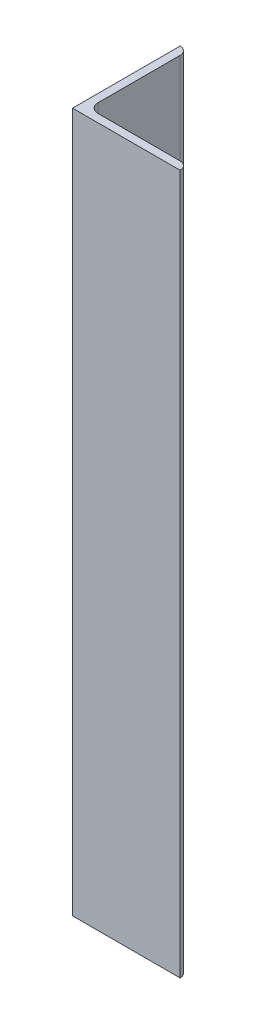
ISO-10303-21;
HEADER;
FILE_DESCRIPTION(('STEP AP214'),'2;1');
FILE_NAME('part.step','',(''),(''),'','','');
FILE_SCHEMA(('AUTOMOTIVE_DESIGN { 1 0 10303 214 1 1 1 1 }'));
ENDSEC;
DATA;
#1=APPLICATION_CONTEXT('core data for automotive mechanical design processes');
#2=APPLICATION_PROTOCOL_DEFINITION('international standard','automotive_design',2000,#1);
#3=PRODUCT_CONTEXT('',#1,'mechanical');
#4=PRODUCT('Part','Part','',(#3));
#5=PRODUCT_RELATED_PRODUCT_CATEGORY('part','',(#4));
#6=PRODUCT_DEFINITION_FORMATION('','',#4);
#7=PRODUCT_DEFINITION_CONTEXT('part definition',#1,'design');
#8=PRODUCT_DEFINITION('design','',#6,#7);
#9=PRODUCT_DEFINITION_SHAPE('','',#8);
#10=(LENGTH_UNIT() NAMED_UNIT(*) SI_UNIT(.MILLI.,.METRE.));
#11=(NAMED_UNIT(*) PLANE_ANGLE_UNIT() SI_UNIT($,.RADIAN.));
#12=(NAMED_UNIT(*) SI_UNIT($,.STERADIAN.) SOLID_ANGLE_UNIT());
#13=UNCERTAINTY_MEASURE_WITH_UNIT(LENGTH_MEASURE(1.E-05),#10,'distance_accuracy_value','');
#14=(GEOMETRIC_REPRESENTATION_CONTEXT(3) GLOBAL_UNCERTAINTY_ASSIGNED_CONTEXT((#13)) GLOBAL_UNIT_ASSIGNED_CONTEXT((#10,
#11,#12)) REPRESENTATION_CONTEXT('',''));
#15=CARTESIAN_POINT('',(0.,0.,0.));
#16=DIRECTION('',(0.,0.,1.));
#17=DIRECTION('',(1.,0.,0.));
#18=AXIS2_PLACEMENT_3D('',#15,#16,#17);
#19=CARTESIAN_POINT('',(6.5,260.,-6.5));
#20=DIRECTION('',(0.,-1.,0.));
#21=DIRECTION('',(0.,0.,-1.));
#22=AXIS2_PLACEMENT_3D('',#19,#20,#21);
#23=CYLINDRICAL_SURFACE('',#22,3.5);
#24=CARTESIAN_POINT('',(3.,53.,-6.5));
#25=CARTESIAN_POINT('',(3.00003465615781,52.880587045641,-6.41041578691727));
#26=CARTESIAN_POINT('',(3.00343908972094,52.7572091536423,-6.32626209532385));
#27=CARTESIAN_POINT('',(3.01475149706634,52.5036429804455,-6.16941930243955));
#28=CARTESIAN_POINT('',(3.02265705055746,52.3734583934039,-6.09672406663878));
#29=CARTESIAN_POINT('',(3.0407457169967,52.1071912285186,-5.96326592235403));
#30=CARTESIAN_POINT('',(3.05093013692755,51.9711053023729,-5.90250989899215));
#31=CARTESIAN_POINT('',(3.0716218282051,51.6940682025578,-5.79337793603691));
#32=CARTESIAN_POINT('',(3.08212911471688,51.553116800318,-5.74500257896358));
#33=CARTESIAN_POINT('',(3.10103079349939,51.2781965850149,-5.6641793572028));
#34=CARTESIAN_POINT('',(3.10952492033591,51.1445069207829,-5.630802989711));
#35=CARTESIAN_POINT('',(3.12427183226853,50.8747130810141,-5.57518095020948));
#36=CARTESIAN_POINT('',(3.13052480368225,50.7386091071777,-5.5529343528696));
#37=CARTESIAN_POINT('',(3.14001955973739,50.4651416451601,-5.5197808130512));
#38=CARTESIAN_POINT('',(3.14326616892785,50.3277805334759,-5.5088556987189));
#39=CARTESIAN_POINT('',(3.14637663539547,50.0525849594647,-5.49838081504847));
#40=CARTESIAN_POINT('',(3.14624049666752,49.914750497697,-5.49883103227655));
#41=CARTESIAN_POINT('',(3.14261445658247,49.6405795785242,-5.51106038294783));
#42=CARTESIAN_POINT('',(3.13914755507232,49.5042393296797,-5.52276182400619));
#43=CARTESIAN_POINT('',(3.12930369663528,49.2330780071279,-5.55727686094002));
#44=CARTESIAN_POINT('',(3.12292663400514,49.0982569887846,-5.58009086044926));
#45=CARTESIAN_POINT('',(3.10802002821223,48.830905330998,-5.63667698800648));
#46=CARTESIAN_POINT('',(3.09948809255575,48.698377413432,-5.67046130807605));
#47=CARTESIAN_POINT('',(3.08134196208269,48.4366066864843,-5.74874102719263));
#48=CARTESIAN_POINT('',(3.07172784053944,48.3073636554127,-5.79323570128818));
#49=CARTESIAN_POINT('',(3.05437572725588,48.0750153719139,-5.88402982037458));
#50=CARTESIAN_POINT('',(3.04660149471746,47.9712639401068,-5.92867838985153));
#51=CARTESIAN_POINT('',(3.03205221100526,47.7669830356644,-6.02491562979986));
#52=CARTESIAN_POINT('',(3.02527691835641,47.6664527889817,-6.07650261725356));
#53=CARTESIAN_POINT('',(3.01364734312072,47.4692073996564,-6.18632402594371));
#54=CARTESIAN_POINT('',(3.00878957985084,47.3724856339951,-6.24454615314865));
#55=CARTESIAN_POINT('',(3.00197050062827,47.1830805422588,-6.36747790715241));
#56=CARTESIAN_POINT('',(3.00001076254811,47.0903994428144,-6.43219104762039));
#57=CARTESIAN_POINT('',(3.,47.,-6.50000000000001));
#58=B_SPLINE_CURVE_WITH_KNOTS('',3,(#24,#25,#26,#27,#28,#29,#30,#31,#32,#33,#34,#35,#36,#37,#38,
#39,#40,#41,#42,#43,#44,#45,#46,#47,#48,#49,#50,#51,#52,#53,#54,#55,#56,#57),.UNSPECIFIED.,.F.,
.F.,(4,2,2,2,2,2,2,2,2,2,2,2,2,2,2,2,4),(0.,0.447535207829765,0.894829999062702,
1.34238198476457,1.78995502426764,2.20364646574524,2.61730350715769,3.03029556385332,
3.44328713282238,3.85344722529425,4.26362221683792,4.6742546313859,5.08485925928004,
5.42426309223212,5.76358474565473,6.10228760129509,6.4411748008872),.UNSPECIFIED.);
#59=CARTESIAN_POINT('',(3.,53.,-6.5));
#60=VERTEX_POINT('',#59);
#61=CARTESIAN_POINT('',(3.,47.,-6.5));
#62=VERTEX_POINT('',#61);
#63=EDGE_CURVE('E321',#60,#62,#58,.T.);
#64=ORIENTED_EDGE('',*,*,#63,.F.);
#65=DIRECTION('',(0.,-1.,0.));
#66=VECTOR('',#65,1.);
#67=CARTESIAN_POINT('',(3.,260.,-6.5));
#68=LINE('',#67,#66);
#69=CARTESIAN_POINT('',(3.,76.9999999999999,-6.5));
#70=VERTEX_POINT('',#69);
#71=EDGE_CURVE('E317',#70,#60,#68,.T.);
#72=ORIENTED_EDGE('',*,*,#71,.F.);
#73=CARTESIAN_POINT('',(3.,83.0000000000001,-6.5));
#74=CARTESIAN_POINT('',(3.00003465615781,82.8805870456411,-6.41041578691727));
#75=CARTESIAN_POINT('',(3.00343908972094,82.7572091536424,-6.32626209532385));
#76=CARTESIAN_POINT('',(3.01475149706634,82.5036429804457,-6.16941930243954));
#77=CARTESIAN_POINT('',(3.02265705055746,82.3734583934041,-6.09672406663877));
#78=CARTESIAN_POINT('',(3.0407457169967,82.1071912285188,-5.963265922354));
#79=CARTESIAN_POINT('',(3.05093013692756,81.971105302373,-5.90250989899212));
#80=CARTESIAN_POINT('',(3.07162182820511,81.694068202558,-5.79337793603687));
#81=CARTESIAN_POINT('',(3.08212911471689,81.5531168003182,-5.74500257896354));
#82=CARTESIAN_POINT('',(3.1010307934994,81.2781965850151,-5.66417935720275));
#83=CARTESIAN_POINT('',(3.10952492033592,81.1445069207831,-5.63080298971094));
#84=CARTESIAN_POINT('',(3.12427183226855,80.8747130810142,-5.57518095020942));
#85=CARTESIAN_POINT('',(3.13052480368227,80.7386091071779,-5.55293435286953));
#86=CARTESIAN_POINT('',(3.14001955973742,80.4651416451603,-5.51978081305113));
#87=CARTESIAN_POINT('',(3.14326616892788,80.3277805334761,-5.50885569871882));
#88=CARTESIAN_POINT('',(3.1463766353955,80.0525849594649,-5.49838081504838));
#89=CARTESIAN_POINT('',(3.14624049666755,79.9147504976972,-5.49883103227645));
#90=CARTESIAN_POINT('',(3.14261445658251,79.6405795785244,-5.51106038294772));
#91=CARTESIAN_POINT('',(3.13914755507236,79.5042393296799,-5.52276182400607));
#92=CARTESIAN_POINT('',(3.12930369663531,79.2330780071281,-5.5572768609399));
#93=CARTESIAN_POINT('',(3.12292663400518,79.0982569887848,-5.58009086044913));
#94=CARTESIAN_POINT('',(3.10802002821227,78.8309053309982,-5.63667698800634));
#95=CARTESIAN_POINT('',(3.09948809255579,78.6983774134322,-5.6704613080759));
#96=CARTESIAN_POINT('',(3.08134196208273,78.4366066864845,-5.74874102719247));
#97=CARTESIAN_POINT('',(3.07172784053948,78.3073636554129,-5.79323570128802));
#98=CARTESIAN_POINT('',(3.05437572725591,78.0750153719141,-5.88402982037442));
#99=CARTESIAN_POINT('',(3.04660149471749,77.9712639401069,-5.92867838985137));
#100=CARTESIAN_POINT('',(3.03205221100528,77.7669830356645,-6.02491562979973));
#101=CARTESIAN_POINT('',(3.02527691835642,77.6664527889818,-6.07650261725344));
#102=CARTESIAN_POINT('',(3.01364734312073,77.4692073996564,-6.18632402594362));
#103=CARTESIAN_POINT('',(3.00878957985085,77.3724856339951,-6.24454615314858));
#104=CARTESIAN_POINT('',(3.00197050062827,77.1830805422587,-6.36747790715237));
#105=CARTESIAN_POINT('',(3.00001076254811,77.0903994428144,-6.43219104762036));
#106=CARTESIAN_POINT('',(3.,76.9999999999999,-6.5));
#107=B_SPLINE_CURVE_WITH_KNOTS('',3,(#73,#74,#75,#76,#77,#78,#79,#80,#81,#82,#83,#84,#85,#86,
#87,#88,#89,#90,#91,#92,#93,#94,#95,#96,#97,#98,#99,#100,#101,#102,#103,#104,#105,#106),
.UNSPECIFIED.,.F.,.F.,(4,2,2,2,2,2,2,2,2,2,2,2,2,2,2,2,4),(0.,0.447535207829761,
0.894829999062705,1.34238198476459,1.78995502426765,2.20364646574525,2.61730350715769,
3.03029556385332,3.44328713282236,3.85344722529422,4.26362221683789,4.67425463138587,
5.08485925928002,5.42426309223217,5.76358474565488,6.10228760129531,6.44117480088752),.UNSPECIFIED.);
#108=CARTESIAN_POINT('',(3.,83.0000000000001,-6.5));
#109=VERTEX_POINT('',#108);
#110=EDGE_CURVE('E265',#109,#70,#107,.T.);
#111=ORIENTED_EDGE('',*,*,#110,.F.);
#112=CARTESIAN_POINT('',(3.,260.,-6.5));
#113=VERTEX_POINT('',#112);
#114=EDGE_CURVE('E345',#113,#109,#68,.T.);
#115=ORIENTED_EDGE('',*,*,#114,.F.);
#116=CARTESIAN_POINT('',(6.5,260.,-6.5));
#117=DIRECTION('',(0.,-1.,0.));
#118=DIRECTION('',(0.,0.,-1.));
#119=AXIS2_PLACEMENT_3D('',#116,#117,#118);
#120=CIRCLE('',#119,3.5);
#121=CARTESIAN_POINT('',(6.5,260.,-3.));
#122=VERTEX_POINT('',#121);
#123=EDGE_CURVE('E401',#122,#113,#120,.T.);
#124=ORIENTED_EDGE('',*,*,#123,.F.);
#125=DIRECTION('',(0.,-1.,0.));
#126=VECTOR('',#125,1.);
#127=CARTESIAN_POINT('',(6.5,260.,-3.));
#128=LINE('',#127,#126);
#129=CARTESIAN_POINT('',(6.5,0.,-3.));
#130=VERTEX_POINT('',#129);
#131=EDGE_CURVE('E350',#122,#130,#128,.T.);
#132=ORIENTED_EDGE('',*,*,#131,.T.);
#133=CARTESIAN_POINT('',(6.5,0.,-6.5));
#134=DIRECTION('',(0.,-1.,0.));
#135=DIRECTION('',(0.,0.,-1.));
#136=AXIS2_PLACEMENT_3D('',#133,#134,#135);
#137=CIRCLE('',#136,3.5);
#138=CARTESIAN_POINT('',(3.,0.,-6.5));
#139=VERTEX_POINT('',#138);
#140=EDGE_CURVE('E386',#130,#139,#137,.T.);
#141=ORIENTED_EDGE('',*,*,#140,.T.);
#142=EDGE_CURVE('E352',#62,#139,#68,.T.);
#143=ORIENTED_EDGE('',*,*,#142,.F.);
#144=EDGE_LOOP('',(#64,#72,#111,#115,#124,#132,#141,#143));
#145=FACE_BOUND('',#144,.T.);
#146=ADVANCED_FACE('F65',(#145),#23,.F.);
#147=CARTESIAN_POINT('',(3.,260.,-37.));
#148=DIRECTION('',(-1.,0.,0.));
#149=DIRECTION('',(0.,0.,1.));
#150=AXIS2_PLACEMENT_3D('',#147,#148,#149);
#151=PLANE('',#150);
#152=CARTESIAN_POINT('',(3.,50.,-10.5));
#153=DIRECTION('',(-1.,0.,0.));
#154=DIRECTION('',(0.,0.,1.));
#155=AXIS2_PLACEMENT_3D('',#152,#153,#154);
#156=CIRCLE('',#155,5.);
#157=CARTESIAN_POINT('',(3.,55.,-10.5));
#158=VERTEX_POINT('',#157);
#159=EDGE_CURVE('E313',#158,#60,#156,.F.);
#160=ORIENTED_EDGE('',*,*,#159,.F.);
#161=DIRECTION('',(0.,0.,1.));
#162=VECTOR('',#161,1.);
#163=CARTESIAN_POINT('',(3.,55.,-37.));
#164=LINE('',#163,#162);
#165=CARTESIAN_POINT('',(3.,55.,-25.5));
#166=VERTEX_POINT('',#165);
#167=EDGE_CURVE('E275',#166,#158,#164,.T.);
#168=ORIENTED_EDGE('',*,*,#167,.F.);
#169=CARTESIAN_POINT('',(3.,50.,-25.5));
#170=DIRECTION('',(-1.,0.,0.));
#171=DIRECTION('',(0.,0.,1.));
#172=AXIS2_PLACEMENT_3D('',#169,#170,#171);
#173=CIRCLE('',#172,5.);
#174=CARTESIAN_POINT('',(3.,45.,-25.5));
#175=VERTEX_POINT('',#174);
#176=EDGE_CURVE('E333',#175,#166,#173,.F.);
#177=ORIENTED_EDGE('',*,*,#176,.F.);
#178=DIRECTION('',(0.,0.,-1.));
#179=VECTOR('',#178,1.);
#180=CARTESIAN_POINT('',(3.,45.,-37.));
#181=LINE('',#180,#179);
#182=CARTESIAN_POINT('',(3.,45.,-10.5));
#183=VERTEX_POINT('',#182);
#184=EDGE_CURVE('E331',#183,#175,#181,.T.);
#185=ORIENTED_EDGE('',*,*,#184,.F.);
#186=EDGE_CURVE('E192',#62,#183,#156,.F.);
#187=ORIENTED_EDGE('',*,*,#186,.F.);
#188=ORIENTED_EDGE('',*,*,#142,.T.);
#189=DIRECTION('',(0.,0.,-1.));
#190=VECTOR('',#189,1.);
#191=CARTESIAN_POINT('',(3.,0.,-37.));
#192=LINE('',#191,#190);
#193=CARTESIAN_POINT('',(3.,0.,-37.));
#194=VERTEX_POINT('',#193);
#195=EDGE_CURVE('E383',#139,#194,#192,.T.);
#196=ORIENTED_EDGE('',*,*,#195,.T.);
#197=DIRECTION('',(0.,-1.,0.));
#198=VECTOR('',#197,1.);
#199=CARTESIAN_POINT('',(3.,260.,-37.));
#200=LINE('',#199,#198);
#201=CARTESIAN_POINT('',(3.,260.,-37.));
#202=VERTEX_POINT('',#201);
#203=EDGE_CURVE('E359',#202,#194,#200,.T.);
#204=ORIENTED_EDGE('',*,*,#203,.F.);
#205=DIRECTION('',(0.,0.,-1.));
#206=VECTOR('',#205,1.);
#207=CARTESIAN_POINT('',(3.,260.,-37.));
#208=LINE('',#207,#206);
#209=EDGE_CURVE('E348',#113,#202,#208,.T.);
#210=ORIENTED_EDGE('',*,*,#209,.F.);
#211=ORIENTED_EDGE('',*,*,#114,.T.);
#212=CARTESIAN_POINT('',(3.,80.,-10.4999999999999));
#213=DIRECTION('',(-1.,0.,0.));
#214=DIRECTION('',(0.,0.,1.));
#215=AXIS2_PLACEMENT_3D('',#212,#213,#214);
#216=CIRCLE('',#215,4.99999999999999);
#217=CARTESIAN_POINT('',(3.,85.,-10.4999999999999));
#218=VERTEX_POINT('',#217);
#219=EDGE_CURVE('E266',#218,#109,#216,.F.);
#220=ORIENTED_EDGE('',*,*,#219,.F.);
#221=DIRECTION('',(0.,0.,1.));
#222=VECTOR('',#221,1.);
#223=CARTESIAN_POINT('',(3.,85.,-37.));
#224=LINE('',#223,#222);
#225=CARTESIAN_POINT('',(3.,85.,-25.4999999999999));
#226=VERTEX_POINT('',#225);
#227=EDGE_CURVE('E196',#226,#218,#224,.T.);
#228=ORIENTED_EDGE('',*,*,#227,.F.);
#229=CARTESIAN_POINT('',(3.,80.,-25.4999999999999));
#230=DIRECTION('',(-1.,0.,0.));
#231=DIRECTION('',(0.,0.,1.));
#232=AXIS2_PLACEMENT_3D('',#229,#230,#231);
#233=CIRCLE('',#232,4.99999999999999);
#234=CARTESIAN_POINT('',(3.,75.,-25.4999999999999));
#235=VERTEX_POINT('',#234);
#236=EDGE_CURVE('E256',#235,#226,#233,.F.);
#237=ORIENTED_EDGE('',*,*,#236,.F.);
#238=DIRECTION('',(0.,0.,-1.));
#239=VECTOR('',#238,1.);
#240=CARTESIAN_POINT('',(3.,75.,-37.));
#241=LINE('',#240,#239);
#242=CARTESIAN_POINT('',(3.,75.,-10.4999999999999));
#243=VERTEX_POINT('',#242);
#244=EDGE_CURVE('E259',#243,#235,#241,.T.);
#245=ORIENTED_EDGE('',*,*,#244,.F.);
#246=EDGE_CURVE('E262',#70,#243,#216,.F.);
#247=ORIENTED_EDGE('',*,*,#246,.F.);
#248=ORIENTED_EDGE('',*,*,#71,.T.);
#249=EDGE_LOOP('',(#160,#168,#177,#185,#187,#188,#196,#204,#210,#211,#220,#228,#237,#245,#247,#248));
#250=FACE_BOUND('',#249,.T.);
#251=ADVANCED_FACE('F299',(#250),#151,.F.);
#252=CARTESIAN_POINT('',(0.,260.,0.));
#253=DIRECTION('',(1.,0.,0.));
#254=DIRECTION('',(0.,0.,-1.));
#255=AXIS2_PLACEMENT_3D('',#252,#253,#254);
#256=PLANE('',#255);
#257=CARTESIAN_POINT('',(0.,80.,-10.4999999999999));
#258=DIRECTION('',(1.,0.,0.));
#259=DIRECTION('',(0.,0.,-1.));
#260=AXIS2_PLACEMENT_3D('',#257,#258,#259);
#261=CIRCLE('',#260,4.99999999999999);
#262=CARTESIAN_POINT('',(0.,85.,-10.4999999999999));
#263=VERTEX_POINT('',#262);
#264=CARTESIAN_POINT('',(0.,75.,-10.4999999999999));
#265=VERTEX_POINT('',#264);
#266=EDGE_CURVE('E230',#263,#265,#261,.T.);
#267=ORIENTED_EDGE('',*,*,#266,.T.);
#268=DIRECTION('',(0.,0.,-1.));
#269=VECTOR('',#268,1.);
#270=CARTESIAN_POINT('',(0.,75.,-10.4999999999999));
#271=LINE('',#270,#269);
#272=CARTESIAN_POINT('',(0.,75.,-25.4999999999999));
#273=VERTEX_POINT('',#272);
#274=EDGE_CURVE('E234',#265,#273,#271,.T.);
#275=ORIENTED_EDGE('',*,*,#274,.T.);
#276=CARTESIAN_POINT('',(0.,80.,-25.4999999999999));
#277=DIRECTION('',(1.,0.,0.));
#278=DIRECTION('',(0.,0.,-1.));
#279=AXIS2_PLACEMENT_3D('',#276,#277,#278);
#280=CIRCLE('',#279,4.99999999999999);
#281=CARTESIAN_POINT('',(0.,85.,-25.4999999999999));
#282=VERTEX_POINT('',#281);
#283=EDGE_CURVE('E238',#273,#282,#280,.T.);
#284=ORIENTED_EDGE('',*,*,#283,.T.);
#285=DIRECTION('',(0.,0.,1.));
#286=VECTOR('',#285,1.);
#287=CARTESIAN_POINT('',(0.,85.,-10.4999999999999));
#288=LINE('',#287,#286);
#289=EDGE_CURVE('E242',#282,#263,#288,.T.);
#290=ORIENTED_EDGE('',*,*,#289,.T.);
#291=EDGE_LOOP('',(#267,#275,#284,#290));
#292=FACE_BOUND('',#291,.T.);
#293=DIRECTION('',(0.,0.,1.));
#294=VECTOR('',#293,1.);
#295=CARTESIAN_POINT('',(0.,0.,0.));
#296=LINE('',#295,#294);
#297=CARTESIAN_POINT('',(0.,0.,-40.));
#298=VERTEX_POINT('',#297);
#299=CARTESIAN_POINT('',(0.,0.,0.));
#300=VERTEX_POINT('',#299);
#301=EDGE_CURVE('E376',#298,#300,#296,.T.);
#302=ORIENTED_EDGE('',*,*,#301,.T.);
#303=DIRECTION('',(0.,-1.,0.));
#304=VECTOR('',#303,1.);
#305=CARTESIAN_POINT('',(0.,260.,0.));
#306=LINE('',#305,#304);
#307=CARTESIAN_POINT('',(0.,260.,0.));
#308=VERTEX_POINT('',#307);
#309=EDGE_CURVE('E369',#308,#300,#306,.T.);
#310=ORIENTED_EDGE('',*,*,#309,.F.);
#311=DIRECTION('',(0.,0.,1.));
#312=VECTOR('',#311,1.);
#313=CARTESIAN_POINT('',(0.,260.,0.));
#314=LINE('',#313,#312);
#315=CARTESIAN_POINT('',(0.,260.,-40.));
#316=VERTEX_POINT('',#315);
#317=EDGE_CURVE('E375',#316,#308,#314,.T.);
#318=ORIENTED_EDGE('',*,*,#317,.F.);
#319=DIRECTION('',(0.,-1.,0.));
#320=VECTOR('',#319,1.);
#321=CARTESIAN_POINT('',(0.,260.,-40.));
#322=LINE('',#321,#320);
#323=EDGE_CURVE('E364',#316,#298,#322,.T.);
#324=ORIENTED_EDGE('',*,*,#323,.T.);
#325=EDGE_LOOP('',(#302,#310,#318,#324));
#326=FACE_BOUND('',#325,.T.);
#327=CARTESIAN_POINT('',(0.,50.,-10.5));
#328=DIRECTION('',(1.,0.,0.));
#329=DIRECTION('',(0.,0.,-1.));
#330=AXIS2_PLACEMENT_3D('',#327,#328,#329);
#331=CIRCLE('',#330,5.);
#332=CARTESIAN_POINT('',(0.,55.,-10.5));
#333=VERTEX_POINT('',#332);
#334=CARTESIAN_POINT('',(0.,45.,-10.5));
#335=VERTEX_POINT('',#334);
#336=EDGE_CURVE('E189',#333,#335,#331,.T.);
#337=ORIENTED_EDGE('',*,*,#336,.T.);
#338=DIRECTION('',(0.,0.,-1.));
#339=VECTOR('',#338,1.);
#340=CARTESIAN_POINT('',(0.,45.,-10.5));
#341=LINE('',#340,#339);
#342=CARTESIAN_POINT('',(0.,45.,-25.5));
#343=VERTEX_POINT('',#342);
#344=EDGE_CURVE('E200',#335,#343,#341,.T.);
#345=ORIENTED_EDGE('',*,*,#344,.T.);
#346=CARTESIAN_POINT('',(0.,50.,-25.5));
#347=DIRECTION('',(1.,0.,0.));
#348=DIRECTION('',(0.,0.,-1.));
#349=AXIS2_PLACEMENT_3D('',#346,#347,#348);
#350=CIRCLE('',#349,5.);
#351=CARTESIAN_POINT('',(0.,55.,-25.5));
#352=VERTEX_POINT('',#351);
#353=EDGE_CURVE('E207',#343,#352,#350,.T.);
#354=ORIENTED_EDGE('',*,*,#353,.T.);
#355=DIRECTION('',(0.,0.,1.));
#356=VECTOR('',#355,1.);
#357=CARTESIAN_POINT('',(0.,55.,-10.5));
#358=LINE('',#357,#356);
#359=EDGE_CURVE('E211',#352,#333,#358,.T.);
#360=ORIENTED_EDGE('',*,*,#359,.T.);
#361=EDGE_LOOP('',(#337,#345,#354,#360));
#362=FACE_BOUND('',#361,.T.);
#363=ADVANCED_FACE('F210',(#292,#326,#362),#256,.F.);
#364=CARTESIAN_POINT('',(40.,260.,0.));
#365=DIRECTION('',(0.,0.,-1.));
#366=DIRECTION('',(-1.,0.,0.));
#367=AXIS2_PLACEMENT_3D('',#364,#365,#366);
#368=PLANE('',#367);
#369=DIRECTION('',(1.,0.,0.));
#370=VECTOR('',#369,1.);
#371=CARTESIAN_POINT('',(40.,0.,0.));
#372=LINE('',#371,#370);
#373=CARTESIAN_POINT('',(40.,0.,0.));
#374=VERTEX_POINT('',#373);
#375=EDGE_CURVE('E320',#300,#374,#372,.T.);
#376=ORIENTED_EDGE('',*,*,#375,.T.);
#377=DIRECTION('',(0.,-1.,0.));
#378=VECTOR('',#377,1.);
#379=CARTESIAN_POINT('',(40.,260.,0.));
#380=LINE('',#379,#378);
#381=CARTESIAN_POINT('',(40.,260.,0.));
#382=VERTEX_POINT('',#381);
#383=EDGE_CURVE('E13',#382,#374,#380,.T.);
#384=ORIENTED_EDGE('',*,*,#383,.F.);
#385=DIRECTION('',(1.,0.,0.));
#386=VECTOR('',#385,1.);
#387=CARTESIAN_POINT('',(40.,260.,0.));
#388=LINE('',#387,#386);
#389=EDGE_CURVE('E379',#308,#382,#388,.T.);
#390=ORIENTED_EDGE('',*,*,#389,.F.);
#391=ORIENTED_EDGE('',*,*,#309,.T.);
#392=EDGE_LOOP('',(#376,#384,#390,#391));
#393=FACE_BOUND('',#392,.T.);
#394=ADVANCED_FACE('F67',(#393),#368,.F.);
#395=CARTESIAN_POINT('',(37.,260.,0.));
#396=DIRECTION('',(0.,-1.,0.));
#397=DIRECTION('',(0.,0.,-1.));
#398=AXIS2_PLACEMENT_3D('',#395,#396,#397);
#399=CYLINDRICAL_SURFACE('',#398,3.00000000000001);
#400=CARTESIAN_POINT('',(37.,0.,0.));
#401=DIRECTION('',(0.,1.,0.));
#402=DIRECTION('',(0.,0.,1.));
#403=AXIS2_PLACEMENT_3D('',#400,#401,#402);
#404=CIRCLE('',#403,3.00000000000001);
#405=CARTESIAN_POINT('',(37.,0.,-3.));
#406=VERTEX_POINT('',#405);
#407=EDGE_CURVE('E326',#374,#406,#404,.T.);
#408=ORIENTED_EDGE('',*,*,#407,.T.);
#409=DIRECTION('',(0.,-1.,0.));
#410=VECTOR('',#409,1.);
#411=CARTESIAN_POINT('',(37.,260.,-3.));
#412=LINE('',#411,#410);
#413=CARTESIAN_POINT('',(37.,260.,-3.));
#414=VERTEX_POINT('',#413);
#415=EDGE_CURVE('E74',#414,#406,#412,.T.);
#416=ORIENTED_EDGE('',*,*,#415,.F.);
#417=CARTESIAN_POINT('',(37.,260.,0.));
#418=DIRECTION('',(0.,1.,0.));
#419=DIRECTION('',(0.,0.,1.));
#420=AXIS2_PLACEMENT_3D('',#417,#418,#419);
#421=CIRCLE('',#420,3.00000000000001);
#422=EDGE_CURVE('E407',#382,#414,#421,.T.);
#423=ORIENTED_EDGE('',*,*,#422,.F.);
#424=ORIENTED_EDGE('',*,*,#383,.T.);
#425=EDGE_LOOP('',(#408,#416,#423,#424));
#426=FACE_BOUND('',#425,.T.);
#427=ADVANCED_FACE('F451',(#426),#399,.T.);
#428=CARTESIAN_POINT('',(6.5,260.,-3.));
#429=DIRECTION('',(0.,0.,1.));
#430=DIRECTION('',(1.,0.,0.));
#431=AXIS2_PLACEMENT_3D('',#428,#429,#430);
#432=PLANE('',#431);
#433=DIRECTION('',(-1.,0.,0.));
#434=VECTOR('',#433,1.);
#435=CARTESIAN_POINT('',(6.5,0.,-3.));
#436=LINE('',#435,#434);
#437=EDGE_CURVE('E389',#406,#130,#436,.T.);
#438=ORIENTED_EDGE('',*,*,#437,.T.);
#439=ORIENTED_EDGE('',*,*,#131,.F.);
#440=DIRECTION('',(-1.,0.,0.));
#441=VECTOR('',#440,1.);
#442=CARTESIAN_POINT('',(6.5,260.,-3.));
#443=LINE('',#442,#441);
#444=EDGE_CURVE('E404',#414,#122,#443,.T.);
#445=ORIENTED_EDGE('',*,*,#444,.F.);
#446=ORIENTED_EDGE('',*,*,#415,.T.);
#447=EDGE_LOOP('',(#438,#439,#445,#446));
#448=FACE_BOUND('',#447,.T.);
#449=ADVANCED_FACE('F302',(#448),#432,.F.);
#450=CARTESIAN_POINT('',(0.,260.,-37.));
#451=DIRECTION('',(0.,-1.,0.));
#452=DIRECTION('',(0.,0.,-1.));
#453=AXIS2_PLACEMENT_3D('',#450,#451,#452);
#454=CYLINDRICAL_SURFACE('',#453,3.);
#455=CARTESIAN_POINT('',(0.,0.,-37.));
#456=DIRECTION('',(0.,1.,0.));
#457=DIRECTION('',(0.,0.,-1.));
#458=AXIS2_PLACEMENT_3D('',#455,#456,#457);
#459=CIRCLE('',#458,3.);
#460=EDGE_CURVE('E380',#194,#298,#459,.T.);
#461=ORIENTED_EDGE('',*,*,#460,.T.);
#462=ORIENTED_EDGE('',*,*,#323,.F.);
#463=CARTESIAN_POINT('',(0.,260.,-37.));
#464=DIRECTION('',(0.,1.,0.));
#465=DIRECTION('',(0.,0.,-1.));
#466=AXIS2_PLACEMENT_3D('',#463,#464,#465);
#467=CIRCLE('',#466,3.);
#468=EDGE_CURVE('E396',#202,#316,#467,.T.);
#469=ORIENTED_EDGE('',*,*,#468,.F.);
#470=ORIENTED_EDGE('',*,*,#203,.T.);
#471=EDGE_LOOP('',(#461,#462,#469,#470));
#472=FACE_BOUND('',#471,.T.);
#473=ADVANCED_FACE('F292',(#472),#454,.T.);
#474=CARTESIAN_POINT('',(0.,260.,-37.));
#475=DIRECTION('',(0.,-1.,0.));
#476=DIRECTION('',(0.,0.,-1.));
#477=AXIS2_PLACEMENT_3D('',#474,#475,#476);
#478=PLANE('',#477);
#479=ORIENTED_EDGE('',*,*,#389,.T.);
#480=ORIENTED_EDGE('',*,*,#422,.T.);
#481=ORIENTED_EDGE('',*,*,#444,.T.);
#482=ORIENTED_EDGE('',*,*,#123,.T.);
#483=ORIENTED_EDGE('',*,*,#209,.T.);
#484=ORIENTED_EDGE('',*,*,#468,.T.);
#485=ORIENTED_EDGE('',*,*,#317,.T.);
#486=EDGE_LOOP('',(#479,#480,#481,#482,#483,#484,#485));
#487=FACE_BOUND('',#486,.T.);
#488=ADVANCED_FACE('F289',(#487),#478,.F.);
#489=CARTESIAN_POINT('',(0.,0.,-37.));
#490=DIRECTION('',(0.,-1.,0.));
#491=DIRECTION('',(0.,0.,-1.));
#492=AXIS2_PLACEMENT_3D('',#489,#490,#491);
#493=PLANE('',#492);
#494=ORIENTED_EDGE('',*,*,#375,.F.);
#495=ORIENTED_EDGE('',*,*,#301,.F.);
#496=ORIENTED_EDGE('',*,*,#460,.F.);
#497=ORIENTED_EDGE('',*,*,#195,.F.);
#498=ORIENTED_EDGE('',*,*,#140,.F.);
#499=ORIENTED_EDGE('',*,*,#437,.F.);
#500=ORIENTED_EDGE('',*,*,#407,.F.);
#501=EDGE_LOOP('',(#494,#495,#496,#497,#498,#499,#500));
#502=FACE_BOUND('',#501,.T.);
#503=ADVANCED_FACE('F286',(#502),#493,.T.);
#504=CARTESIAN_POINT('',(10.,80.,-10.4999999999999));
#505=DIRECTION('',(-1.,0.,0.));
#506=DIRECTION('',(0.,0.,1.));
#507=AXIS2_PLACEMENT_3D('',#504,#505,#506);
#508=CYLINDRICAL_SURFACE('',#507,4.99999999999999);
#509=ORIENTED_EDGE('',*,*,#219,.T.);
#510=ORIENTED_EDGE('',*,*,#110,.T.);
#511=ORIENTED_EDGE('',*,*,#246,.T.);
#512=DIRECTION('',(-1.,0.,0.));
#513=VECTOR('',#512,1.);
#514=CARTESIAN_POINT('',(10.,75.,-10.4999999999999));
#515=LINE('',#514,#513);
#516=EDGE_CURVE('E213',#243,#265,#515,.T.);
#517=ORIENTED_EDGE('',*,*,#516,.T.);
#518=ORIENTED_EDGE('',*,*,#266,.F.);
#519=DIRECTION('',(-1.,0.,0.));
#520=VECTOR('',#519,1.);
#521=CARTESIAN_POINT('',(10.,85.,-10.4999999999999));
#522=LINE('',#521,#520);
#523=EDGE_CURVE('E246',#218,#263,#522,.T.);
#524=ORIENTED_EDGE('',*,*,#523,.F.);
#525=EDGE_LOOP('',(#509,#510,#511,#517,#518,#524));
#526=FACE_BOUND('',#525,.T.);
#527=ADVANCED_FACE('F280',(#526),#508,.F.);
#528=CARTESIAN_POINT('',(10.,75.,-10.4999999999999));
#529=DIRECTION('',(0.,1.,0.));
#530=DIRECTION('',(0.,0.,1.));
#531=AXIS2_PLACEMENT_3D('',#528,#529,#530);
#532=PLANE('',#531);
#533=ORIENTED_EDGE('',*,*,#244,.T.);
#534=DIRECTION('',(-1.,0.,0.));
#535=VECTOR('',#534,1.);
#536=CARTESIAN_POINT('',(10.,75.,-25.4999999999999));
#537=LINE('',#536,#535);
#538=EDGE_CURVE('E216',#235,#273,#537,.T.);
#539=ORIENTED_EDGE('',*,*,#538,.T.);
#540=ORIENTED_EDGE('',*,*,#274,.F.);
#541=ORIENTED_EDGE('',*,*,#516,.F.);
#542=EDGE_LOOP('',(#533,#539,#540,#541));
#543=FACE_BOUND('',#542,.T.);
#544=ADVANCED_FACE('F285',(#543),#532,.T.);
#545=CARTESIAN_POINT('',(10.,80.,-25.4999999999999));
#546=DIRECTION('',(-1.,0.,0.));
#547=DIRECTION('',(0.,0.,1.));
#548=AXIS2_PLACEMENT_3D('',#545,#546,#547);
#549=CYLINDRICAL_SURFACE('',#548,4.99999999999999);
#550=ORIENTED_EDGE('',*,*,#236,.T.);
#551=DIRECTION('',(-1.,0.,0.));
#552=VECTOR('',#551,1.);
#553=CARTESIAN_POINT('',(10.,85.,-25.4999999999999));
#554=LINE('',#553,#552);
#555=EDGE_CURVE('E89',#226,#282,#554,.T.);
#556=ORIENTED_EDGE('',*,*,#555,.T.);
#557=ORIENTED_EDGE('',*,*,#283,.F.);
#558=ORIENTED_EDGE('',*,*,#538,.F.);
#559=EDGE_LOOP('',(#550,#556,#557,#558));
#560=FACE_BOUND('',#559,.T.);
#561=ADVANCED_FACE('F424',(#560),#549,.F.);
#562=CARTESIAN_POINT('',(10.,85.,-10.4999999999999));
#563=DIRECTION('',(0.,-1.,0.));
#564=DIRECTION('',(0.,0.,-1.));
#565=AXIS2_PLACEMENT_3D('',#562,#563,#564);
#566=PLANE('',#565);
#567=ORIENTED_EDGE('',*,*,#227,.T.);
#568=ORIENTED_EDGE('',*,*,#523,.T.);
#569=ORIENTED_EDGE('',*,*,#289,.F.);
#570=ORIENTED_EDGE('',*,*,#555,.F.);
#571=EDGE_LOOP('',(#567,#568,#569,#570));
#572=FACE_BOUND('',#571,.T.);
#573=ADVANCED_FACE('F421',(#572),#566,.T.);
#574=CARTESIAN_POINT('',(10.,50.,-10.5));
#575=DIRECTION('',(-1.,0.,0.));
#576=DIRECTION('',(0.,0.,1.));
#577=AXIS2_PLACEMENT_3D('',#574,#575,#576);
#578=CYLINDRICAL_SURFACE('',#577,5.);
#579=ORIENTED_EDGE('',*,*,#159,.T.);
#580=ORIENTED_EDGE('',*,*,#63,.T.);
#581=ORIENTED_EDGE('',*,*,#186,.T.);
#582=DIRECTION('',(-1.,0.,0.));
#583=VECTOR('',#582,1.);
#584=CARTESIAN_POINT('',(10.,45.,-10.5));
#585=LINE('',#584,#583);
#586=EDGE_CURVE('E184',#183,#335,#585,.T.);
#587=ORIENTED_EDGE('',*,*,#586,.T.);
#588=ORIENTED_EDGE('',*,*,#336,.F.);
#589=DIRECTION('',(-1.,0.,0.));
#590=VECTOR('',#589,1.);
#591=CARTESIAN_POINT('',(10.,55.,-10.5));
#592=LINE('',#591,#590);
#593=EDGE_CURVE('E223',#158,#333,#592,.T.);
#594=ORIENTED_EDGE('',*,*,#593,.F.);
#595=EDGE_LOOP('',(#579,#580,#581,#587,#588,#594));
#596=FACE_BOUND('',#595,.T.);
#597=ADVANCED_FACE('F186',(#596),#578,.F.);
#598=CARTESIAN_POINT('',(10.,45.,-10.5));
#599=DIRECTION('',(0.,1.,0.));
#600=DIRECTION('',(0.,0.,1.));
#601=AXIS2_PLACEMENT_3D('',#598,#599,#600);
#602=PLANE('',#601);
#603=ORIENTED_EDGE('',*,*,#184,.T.);
#604=DIRECTION('',(-1.,0.,0.));
#605=VECTOR('',#604,1.);
#606=CARTESIAN_POINT('',(10.,45.,-25.5));
#607=LINE('',#606,#605);
#608=EDGE_CURVE('E197',#175,#343,#607,.T.);
#609=ORIENTED_EDGE('',*,*,#608,.T.);
#610=ORIENTED_EDGE('',*,*,#344,.F.);
#611=ORIENTED_EDGE('',*,*,#586,.F.);
#612=EDGE_LOOP('',(#603,#609,#610,#611));
#613=FACE_BOUND('',#612,.T.);
#614=ADVANCED_FACE('F201',(#613),#602,.T.);
#615=CARTESIAN_POINT('',(10.,50.,-25.5));
#616=DIRECTION('',(-1.,0.,0.));
#617=DIRECTION('',(0.,0.,1.));
#618=AXIS2_PLACEMENT_3D('',#615,#616,#617);
#619=CYLINDRICAL_SURFACE('',#618,5.);
#620=ORIENTED_EDGE('',*,*,#176,.T.);
#621=DIRECTION('',(-1.,0.,0.));
#622=VECTOR('',#621,1.);
#623=CARTESIAN_POINT('',(10.,55.,-25.5));
#624=LINE('',#623,#622);
#625=EDGE_CURVE('E81',#166,#352,#624,.T.);
#626=ORIENTED_EDGE('',*,*,#625,.T.);
#627=ORIENTED_EDGE('',*,*,#353,.F.);
#628=ORIENTED_EDGE('',*,*,#608,.F.);
#629=EDGE_LOOP('',(#620,#626,#627,#628));
#630=FACE_BOUND('',#629,.T.);
#631=ADVANCED_FACE('F513',(#630),#619,.F.);
#632=CARTESIAN_POINT('',(10.,55.,-10.5));
#633=DIRECTION('',(0.,-1.,0.));
#634=DIRECTION('',(0.,0.,-1.));
#635=AXIS2_PLACEMENT_3D('',#632,#633,#634);
#636=PLANE('',#635);
#637=ORIENTED_EDGE('',*,*,#167,.T.);
#638=ORIENTED_EDGE('',*,*,#593,.T.);
#639=ORIENTED_EDGE('',*,*,#359,.F.);
#640=ORIENTED_EDGE('',*,*,#625,.F.);
#641=EDGE_LOOP('',(#637,#638,#639,#640));
#642=FACE_BOUND('',#641,.T.);
#643=ADVANCED_FACE('F521',(#642),#636,.T.);
#644=CLOSED_SHELL('',(#146,#251,#363,#394,#427,#449,#473,#488,#503,#527,#544,#561,#573,#597,
#614,#631,#643));
#645=MANIFOLD_SOLID_BREP('B2',#644);
#646=ADVANCED_BREP_SHAPE_REPRESENTATION('',(#18,#645),#14);
#647=SHAPE_DEFINITION_REPRESENTATION(#9,#646);
ENDSEC;
END-ISO-10303-21;
